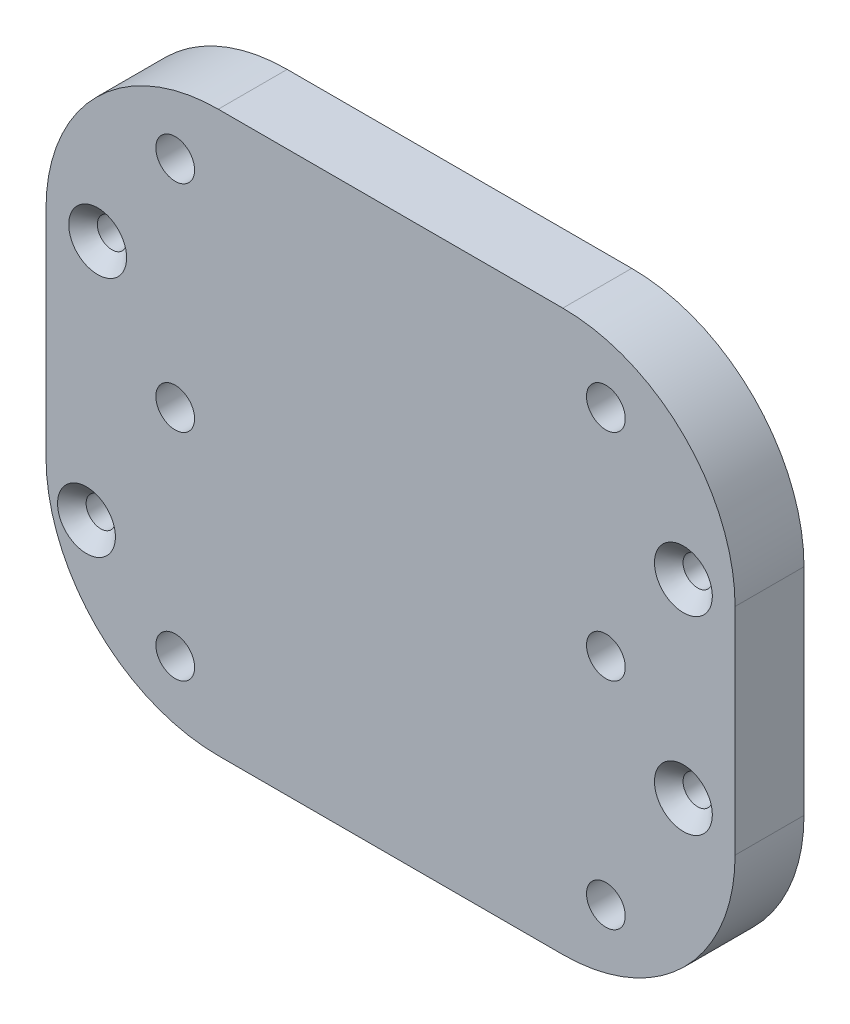
ISO-10303-21;
HEADER;
FILE_DESCRIPTION(('STEP AP214'),'2;1');
FILE_NAME('part.step','',(''),(''),'','','');
FILE_SCHEMA(('AUTOMOTIVE_DESIGN { 1 0 10303 214 1 1 1 1 }'));
ENDSEC;
DATA;
#1=APPLICATION_CONTEXT('core data for automotive mechanical design processes');
#2=APPLICATION_PROTOCOL_DEFINITION('international standard','automotive_design',2000,#1);
#3=PRODUCT_CONTEXT('',#1,'mechanical');
#4=PRODUCT('Part','Part','',(#3));
#5=PRODUCT_RELATED_PRODUCT_CATEGORY('part','',(#4));
#6=PRODUCT_DEFINITION_FORMATION('','',#4);
#7=PRODUCT_DEFINITION_CONTEXT('part definition',#1,'design');
#8=PRODUCT_DEFINITION('design','',#6,#7);
#9=PRODUCT_DEFINITION_SHAPE('','',#8);
#10=(LENGTH_UNIT() NAMED_UNIT(*) SI_UNIT(.MILLI.,.METRE.));
#11=(NAMED_UNIT(*) PLANE_ANGLE_UNIT() SI_UNIT($,.RADIAN.));
#12=(NAMED_UNIT(*) SI_UNIT($,.STERADIAN.) SOLID_ANGLE_UNIT());
#13=UNCERTAINTY_MEASURE_WITH_UNIT(LENGTH_MEASURE(1.E-05),#10,'distance_accuracy_value','');
#14=(GEOMETRIC_REPRESENTATION_CONTEXT(3) GLOBAL_UNCERTAINTY_ASSIGNED_CONTEXT((#13)) GLOBAL_UNIT_ASSIGNED_CONTEXT((#10,
#11,#12)) REPRESENTATION_CONTEXT('',''));
#15=CARTESIAN_POINT('',(0.,0.,0.));
#16=DIRECTION('',(0.,0.,1.));
#17=DIRECTION('',(1.,0.,0.));
#18=AXIS2_PLACEMENT_3D('',#15,#16,#17);
#19=CARTESIAN_POINT('',(84.9999999999998,0.,8.));
#20=DIRECTION('',(0.,1.,0.));
#21=DIRECTION('',(-1.,0.,0.));
#22=AXIS2_PLACEMENT_3D('',#19,#20,#21);
#23=PLANE('',#22);
#24=DIRECTION('',(1.,0.,0.));
#25=VECTOR('',#24,1.);
#26=CARTESIAN_POINT('',(84.9999999999998,0.,8.));
#27=LINE('',#26,#25);
#28=CARTESIAN_POINT('',(25.,0.,8.));
#29=VERTEX_POINT('',#28);
#30=CARTESIAN_POINT('',(64.9999999999998,0.,8.));
#31=VERTEX_POINT('',#30);
#32=EDGE_CURVE('E179',#29,#31,#27,.T.);
#33=ORIENTED_EDGE('',*,*,#32,.F.);
#34=DIRECTION('',(0.,0.,1.));
#35=VECTOR('',#34,1.);
#36=CARTESIAN_POINT('',(25.,0.,0.));
#37=LINE('',#36,#35);
#38=CARTESIAN_POINT('',(25.,0.,0.));
#39=VERTEX_POINT('',#38);
#40=EDGE_CURVE('E155',#29,#39,#37,.F.);
#41=ORIENTED_EDGE('',*,*,#40,.T.);
#42=DIRECTION('',(1.,0.,0.));
#43=VECTOR('',#42,1.);
#44=CARTESIAN_POINT('',(84.9999999999998,0.,0.));
#45=LINE('',#44,#43);
#46=CARTESIAN_POINT('',(64.9999999999998,0.,0.));
#47=VERTEX_POINT('',#46);
#48=EDGE_CURVE('E186',#39,#47,#45,.T.);
#49=ORIENTED_EDGE('',*,*,#48,.T.);
#50=DIRECTION('',(0.,0.,-1.));
#51=VECTOR('',#50,1.);
#52=CARTESIAN_POINT('',(64.9999999999998,0.,8.));
#53=LINE('',#52,#51);
#54=EDGE_CURVE('E152',#47,#31,#53,.F.);
#55=ORIENTED_EDGE('',*,*,#54,.T.);
#56=EDGE_LOOP('',(#33,#41,#49,#55));
#57=FACE_BOUND('',#56,.T.);
#58=ADVANCED_FACE('F39',(#57),#23,.F.);
#59=CARTESIAN_POINT('',(-2.23075399032468E-13,65.,8.));
#60=DIRECTION('',(0.,-1.,0.));
#61=DIRECTION('',(0.,0.,-1.));
#62=AXIS2_PLACEMENT_3D('',#59,#60,#61);
#63=PLANE('',#62);
#64=DIRECTION('',(-1.,0.,0.));
#65=VECTOR('',#64,1.);
#66=CARTESIAN_POINT('',(-2.23075399032468E-13,65.,8.));
#67=LINE('',#66,#65);
#68=CARTESIAN_POINT('',(64.9999999999998,65.,8.));
#69=VERTEX_POINT('',#68);
#70=CARTESIAN_POINT('',(25.,65.,8.));
#71=VERTEX_POINT('',#70);
#72=EDGE_CURVE('E112',#69,#71,#67,.T.);
#73=ORIENTED_EDGE('',*,*,#72,.F.);
#74=DIRECTION('',(0.,0.,-1.));
#75=VECTOR('',#74,1.);
#76=CARTESIAN_POINT('',(64.9999999999998,65.,8.));
#77=LINE('',#76,#75);
#78=CARTESIAN_POINT('',(64.9999999999998,65.,0.));
#79=VERTEX_POINT('',#78);
#80=EDGE_CURVE('E11',#69,#79,#77,.T.);
#81=ORIENTED_EDGE('',*,*,#80,.T.);
#82=DIRECTION('',(-1.,0.,0.));
#83=VECTOR('',#82,1.);
#84=CARTESIAN_POINT('',(-2.23075399032468E-13,65.,0.));
#85=LINE('',#84,#83);
#86=CARTESIAN_POINT('',(25.,65.,0.));
#87=VERTEX_POINT('',#86);
#88=EDGE_CURVE('E177',#79,#87,#85,.T.);
#89=ORIENTED_EDGE('',*,*,#88,.T.);
#90=DIRECTION('',(0.,0.,1.));
#91=VECTOR('',#90,1.);
#92=CARTESIAN_POINT('',(25.,65.,8.));
#93=LINE('',#92,#91);
#94=EDGE_CURVE('E48',#87,#71,#93,.T.);
#95=ORIENTED_EDGE('',*,*,#94,.T.);
#96=EDGE_LOOP('',(#73,#81,#89,#95));
#97=FACE_BOUND('',#96,.T.);
#98=ADVANCED_FACE('F175',(#97),#63,.F.);
#99=CARTESIAN_POINT('',(0.,0.,8.));
#100=DIRECTION('',(0.,0.,-1.));
#101=DIRECTION('',(-1.,0.,0.));
#102=AXIS2_PLACEMENT_3D('',#99,#100,#101);
#103=PLANE('',#102);
#104=CARTESIAN_POINT('',(19.9999999999998,7.49999999999999,8.));
#105=DIRECTION('',(0.,0.,-1.));
#106=DIRECTION('',(-1.,0.,0.));
#107=AXIS2_PLACEMENT_3D('',#104,#105,#106);
#108=CIRCLE('',#107,2.25);
#109=CARTESIAN_POINT('',(17.7499999999998,7.49999999999999,8.));
#110=VERTEX_POINT('',#109);
#111=EDGE_CURVE('E190',#110,#110,#108,.T.);
#112=ORIENTED_EDGE('',*,*,#111,.T.);
#113=EDGE_LOOP('',(#112));
#114=FACE_BOUND('',#113,.T.);
#115=CARTESIAN_POINT('',(69.9999999999997,7.49999999999999,8.));
#116=DIRECTION('',(0.,0.,-1.));
#117=DIRECTION('',(-1.,0.,0.));
#118=AXIS2_PLACEMENT_3D('',#115,#116,#117);
#119=CIRCLE('',#118,2.25);
#120=CARTESIAN_POINT('',(67.7499999999997,7.49999999999999,8.));
#121=VERTEX_POINT('',#120);
#122=EDGE_CURVE('E195',#121,#121,#119,.T.);
#123=ORIENTED_EDGE('',*,*,#122,.T.);
#124=EDGE_LOOP('',(#123));
#125=FACE_BOUND('',#124,.T.);
#126=CARTESIAN_POINT('',(69.9999999999998,32.5,8.));
#127=DIRECTION('',(0.,0.,-1.));
#128=DIRECTION('',(-1.,0.,0.));
#129=AXIS2_PLACEMENT_3D('',#126,#127,#128);
#130=CIRCLE('',#129,2.25);
#131=CARTESIAN_POINT('',(67.7499999999998,32.5,8.));
#132=VERTEX_POINT('',#131);
#133=EDGE_CURVE('E201',#132,#132,#130,.T.);
#134=ORIENTED_EDGE('',*,*,#133,.T.);
#135=EDGE_LOOP('',(#134));
#136=FACE_BOUND('',#135,.T.);
#137=CARTESIAN_POINT('',(19.9999999999998,32.5,8.));
#138=DIRECTION('',(0.,0.,-1.));
#139=DIRECTION('',(-1.,0.,0.));
#140=AXIS2_PLACEMENT_3D('',#137,#138,#139);
#141=CIRCLE('',#140,2.25);
#142=CARTESIAN_POINT('',(17.7499999999998,32.5,8.));
#143=VERTEX_POINT('',#142);
#144=EDGE_CURVE('E207',#143,#143,#141,.T.);
#145=ORIENTED_EDGE('',*,*,#144,.T.);
#146=EDGE_LOOP('',(#145));
#147=FACE_BOUND('',#146,.T.);
#148=CARTESIAN_POINT('',(19.9999999999998,57.5,8.));
#149=DIRECTION('',(0.,0.,-1.));
#150=DIRECTION('',(-1.,0.,0.));
#151=AXIS2_PLACEMENT_3D('',#148,#149,#150);
#152=CIRCLE('',#151,2.25);
#153=CARTESIAN_POINT('',(17.7499999999998,57.5,8.));
#154=VERTEX_POINT('',#153);
#155=EDGE_CURVE('E213',#154,#154,#152,.T.);
#156=ORIENTED_EDGE('',*,*,#155,.T.);
#157=EDGE_LOOP('',(#156));
#158=FACE_BOUND('',#157,.T.);
#159=CARTESIAN_POINT('',(69.9999999999998,57.5,8.));
#160=DIRECTION('',(0.,0.,-1.));
#161=DIRECTION('',(-1.,0.,0.));
#162=AXIS2_PLACEMENT_3D('',#159,#160,#161);
#163=CIRCLE('',#162,2.25);
#164=CARTESIAN_POINT('',(67.7499999999998,57.5,8.));
#165=VERTEX_POINT('',#164);
#166=EDGE_CURVE('E219',#165,#165,#163,.T.);
#167=ORIENTED_EDGE('',*,*,#166,.T.);
#168=EDGE_LOOP('',(#167));
#169=FACE_BOUND('',#168,.T.);
#170=CARTESIAN_POINT('',(9.6999999999999,16.0283122083315,8.));
#171=DIRECTION('',(0.,0.,1.));
#172=DIRECTION('',(1.,0.,0.));
#173=AXIS2_PLACEMENT_3D('',#170,#171,#172);
#174=CIRCLE('',#173,3.36);
#175=CARTESIAN_POINT('',(13.0599999999999,16.0283122083315,8.));
#176=VERTEX_POINT('',#175);
#177=EDGE_CURVE('E234',#176,#176,#174,.T.);
#178=ORIENTED_EDGE('',*,*,#177,.F.);
#179=EDGE_LOOP('',(#178));
#180=FACE_BOUND('',#179,.T.);
#181=CARTESIAN_POINT('',(78.9999999999999,22.7283122083318,8.));
#182=DIRECTION('',(0.,0.,1.));
#183=DIRECTION('',(1.,0.,0.));
#184=AXIS2_PLACEMENT_3D('',#181,#182,#183);
#185=CIRCLE('',#184,3.36);
#186=CARTESIAN_POINT('',(82.3599999999999,22.7283122083318,8.));
#187=VERTEX_POINT('',#186);
#188=EDGE_CURVE('E239',#187,#187,#185,.T.);
#189=ORIENTED_EDGE('',*,*,#188,.F.);
#190=EDGE_LOOP('',(#189));
#191=FACE_BOUND('',#190,.T.);
#192=CARTESIAN_POINT('',(78.9999999999998,44.7283122083318,8.));
#193=DIRECTION('',(0.,0.,1.));
#194=DIRECTION('',(1.,0.,0.));
#195=AXIS2_PLACEMENT_3D('',#192,#193,#194);
#196=CIRCLE('',#195,3.36);
#197=CARTESIAN_POINT('',(82.3599999999998,44.7283122083318,8.));
#198=VERTEX_POINT('',#197);
#199=EDGE_CURVE('E248',#198,#198,#196,.T.);
#200=ORIENTED_EDGE('',*,*,#199,.F.);
#201=EDGE_LOOP('',(#200));
#202=FACE_BOUND('',#201,.T.);
#203=CARTESIAN_POINT('',(10.9999999999998,44.7283122083316,8.));
#204=DIRECTION('',(0.,0.,1.));
#205=DIRECTION('',(1.,0.,0.));
#206=AXIS2_PLACEMENT_3D('',#203,#204,#205);
#207=CIRCLE('',#206,3.36);
#208=CARTESIAN_POINT('',(14.3599999999998,44.7283122083316,8.));
#209=VERTEX_POINT('',#208);
#210=EDGE_CURVE('E344',#209,#209,#207,.T.);
#211=ORIENTED_EDGE('',*,*,#210,.F.);
#212=EDGE_LOOP('',(#211));
#213=FACE_BOUND('',#212,.T.);
#214=DIRECTION('',(0.,-1.,0.));
#215=VECTOR('',#214,1.);
#216=CARTESIAN_POINT('',(5.00000000000001,0.,8.));
#217=LINE('',#216,#215);
#218=CARTESIAN_POINT('',(5.,45.,8.));
#219=VERTEX_POINT('',#218);
#220=CARTESIAN_POINT('',(5.00000000000001,20.,8.));
#221=VERTEX_POINT('',#220);
#222=EDGE_CURVE('E110',#219,#221,#217,.T.);
#223=ORIENTED_EDGE('',*,*,#222,.T.);
#224=CARTESIAN_POINT('',(25.,20.,8.));
#225=DIRECTION('',(0.,0.,-1.));
#226=DIRECTION('',(-1.,0.,0.));
#227=AXIS2_PLACEMENT_3D('',#224,#225,#226);
#228=CIRCLE('',#227,20.);
#229=EDGE_CURVE('E149',#221,#29,#228,.F.);
#230=ORIENTED_EDGE('',*,*,#229,.T.);
#231=ORIENTED_EDGE('',*,*,#32,.T.);
#232=CARTESIAN_POINT('',(64.9999999999998,20.,8.));
#233=DIRECTION('',(0.,0.,-1.));
#234=DIRECTION('',(-1.,0.,0.));
#235=AXIS2_PLACEMENT_3D('',#232,#233,#234);
#236=CIRCLE('',#235,20.);
#237=CARTESIAN_POINT('',(84.9999999999998,20.,8.));
#238=VERTEX_POINT('',#237);
#239=EDGE_CURVE('E146',#31,#238,#236,.F.);
#240=ORIENTED_EDGE('',*,*,#239,.T.);
#241=DIRECTION('',(0.,1.,0.));
#242=VECTOR('',#241,1.);
#243=CARTESIAN_POINT('',(84.9999999999998,65.,8.));
#244=LINE('',#243,#242);
#245=CARTESIAN_POINT('',(84.9999999999998,45.,8.));
#246=VERTEX_POINT('',#245);
#247=EDGE_CURVE('E138',#238,#246,#244,.T.);
#248=ORIENTED_EDGE('',*,*,#247,.T.);
#249=CARTESIAN_POINT('',(64.9999999999998,45.,8.));
#250=DIRECTION('',(0.,0.,-1.));
#251=DIRECTION('',(-1.,0.,0.));
#252=AXIS2_PLACEMENT_3D('',#249,#250,#251);
#253=CIRCLE('',#252,20.);
#254=EDGE_CURVE('E118',#246,#69,#253,.F.);
#255=ORIENTED_EDGE('',*,*,#254,.T.);
#256=ORIENTED_EDGE('',*,*,#72,.T.);
#257=CARTESIAN_POINT('',(25.,45.,8.));
#258=DIRECTION('',(0.,0.,-1.));
#259=DIRECTION('',(-1.,0.,0.));
#260=AXIS2_PLACEMENT_3D('',#257,#258,#259);
#261=CIRCLE('',#260,20.);
#262=EDGE_CURVE('E107',#71,#219,#261,.F.);
#263=ORIENTED_EDGE('',*,*,#262,.T.);
#264=EDGE_LOOP('',(#223,#230,#231,#240,#248,#255,#256,#263));
#265=FACE_BOUND('',#264,.T.);
#266=ADVANCED_FACE('F109',(#114,#125,#136,#147,#158,#169,#180,#191,#202,#213,#265),#103,.F.);
#267=CARTESIAN_POINT('',(0.,0.,0.));
#268=DIRECTION('',(0.,0.,-1.));
#269=DIRECTION('',(-1.,0.,0.));
#270=AXIS2_PLACEMENT_3D('',#267,#268,#269);
#271=PLANE('',#270);
#272=CARTESIAN_POINT('',(10.9999999999998,44.7283122083316,0.));
#273=DIRECTION('',(0.,0.,-1.));
#274=DIRECTION('',(-1.,0.,0.));
#275=AXIS2_PLACEMENT_3D('',#272,#273,#274);
#276=CIRCLE('',#275,1.7);
#277=CARTESIAN_POINT('',(9.29999999999981,44.7283122083316,0.));
#278=VERTEX_POINT('',#277);
#279=EDGE_CURVE('E141',#278,#278,#276,.T.);
#280=ORIENTED_EDGE('',*,*,#279,.F.);
#281=EDGE_LOOP('',(#280));
#282=FACE_BOUND('',#281,.T.);
#283=CARTESIAN_POINT('',(78.9999999999998,44.7283122083318,0.));
#284=DIRECTION('',(0.,0.,-1.));
#285=DIRECTION('',(-1.,0.,0.));
#286=AXIS2_PLACEMENT_3D('',#283,#284,#285);
#287=CIRCLE('',#286,1.69999999999999);
#288=CARTESIAN_POINT('',(77.2999999999998,44.7283122083318,0.));
#289=VERTEX_POINT('',#288);
#290=EDGE_CURVE('E236',#289,#289,#287,.T.);
#291=ORIENTED_EDGE('',*,*,#290,.F.);
#292=EDGE_LOOP('',(#291));
#293=FACE_BOUND('',#292,.T.);
#294=CARTESIAN_POINT('',(78.9999999999999,22.7283122083318,0.));
#295=DIRECTION('',(0.,0.,-1.));
#296=DIRECTION('',(-1.,0.,0.));
#297=AXIS2_PLACEMENT_3D('',#294,#295,#296);
#298=CIRCLE('',#297,1.69999999999999);
#299=CARTESIAN_POINT('',(77.2999999999999,22.7283122083318,0.));
#300=VERTEX_POINT('',#299);
#301=EDGE_CURVE('E231',#300,#300,#298,.T.);
#302=ORIENTED_EDGE('',*,*,#301,.F.);
#303=EDGE_LOOP('',(#302));
#304=FACE_BOUND('',#303,.T.);
#305=CARTESIAN_POINT('',(9.6999999999999,16.0283122083315,0.));
#306=DIRECTION('',(0.,0.,-1.));
#307=DIRECTION('',(-1.,0.,0.));
#308=AXIS2_PLACEMENT_3D('',#305,#306,#307);
#309=CIRCLE('',#308,1.7);
#310=CARTESIAN_POINT('',(7.9999999999999,16.0283122083315,0.));
#311=VERTEX_POINT('',#310);
#312=EDGE_CURVE('E225',#311,#311,#309,.T.);
#313=ORIENTED_EDGE('',*,*,#312,.F.);
#314=EDGE_LOOP('',(#313));
#315=FACE_BOUND('',#314,.T.);
#316=CARTESIAN_POINT('',(69.9999999999998,57.5,0.));
#317=DIRECTION('',(0.,0.,-1.));
#318=DIRECTION('',(-1.,0.,0.));
#319=AXIS2_PLACEMENT_3D('',#316,#317,#318);
#320=CIRCLE('',#319,4.48);
#321=CARTESIAN_POINT('',(65.5199999999998,57.5,0.));
#322=VERTEX_POINT('',#321);
#323=EDGE_CURVE('E229',#322,#322,#320,.T.);
#324=ORIENTED_EDGE('',*,*,#323,.F.);
#325=EDGE_LOOP('',(#324));
#326=FACE_BOUND('',#325,.T.);
#327=CARTESIAN_POINT('',(19.9999999999998,57.5,0.));
#328=DIRECTION('',(0.,0.,-1.));
#329=DIRECTION('',(-1.,0.,0.));
#330=AXIS2_PLACEMENT_3D('',#327,#328,#329);
#331=CIRCLE('',#330,4.48);
#332=CARTESIAN_POINT('',(15.5199999999998,57.5,0.));
#333=VERTEX_POINT('',#332);
#334=EDGE_CURVE('E223',#333,#333,#331,.T.);
#335=ORIENTED_EDGE('',*,*,#334,.F.);
#336=EDGE_LOOP('',(#335));
#337=FACE_BOUND('',#336,.T.);
#338=CARTESIAN_POINT('',(19.9999999999998,32.5,0.));
#339=DIRECTION('',(0.,0.,-1.));
#340=DIRECTION('',(-1.,0.,0.));
#341=AXIS2_PLACEMENT_3D('',#338,#339,#340);
#342=CIRCLE('',#341,4.48);
#343=CARTESIAN_POINT('',(15.5199999999998,32.5,0.));
#344=VERTEX_POINT('',#343);
#345=EDGE_CURVE('E217',#344,#344,#342,.T.);
#346=ORIENTED_EDGE('',*,*,#345,.F.);
#347=EDGE_LOOP('',(#346));
#348=FACE_BOUND('',#347,.T.);
#349=CARTESIAN_POINT('',(69.9999999999998,32.5,0.));
#350=DIRECTION('',(0.,0.,-1.));
#351=DIRECTION('',(-1.,0.,0.));
#352=AXIS2_PLACEMENT_3D('',#349,#350,#351);
#353=CIRCLE('',#352,4.48);
#354=CARTESIAN_POINT('',(65.5199999999998,32.5,0.));
#355=VERTEX_POINT('',#354);
#356=EDGE_CURVE('E211',#355,#355,#353,.T.);
#357=ORIENTED_EDGE('',*,*,#356,.F.);
#358=EDGE_LOOP('',(#357));
#359=FACE_BOUND('',#358,.T.);
#360=CARTESIAN_POINT('',(69.9999999999997,7.49999999999999,0.));
#361=DIRECTION('',(0.,0.,-1.));
#362=DIRECTION('',(-1.,0.,0.));
#363=AXIS2_PLACEMENT_3D('',#360,#361,#362);
#364=CIRCLE('',#363,4.48);
#365=CARTESIAN_POINT('',(65.5199999999997,7.49999999999999,0.));
#366=VERTEX_POINT('',#365);
#367=EDGE_CURVE('E205',#366,#366,#364,.T.);
#368=ORIENTED_EDGE('',*,*,#367,.F.);
#369=EDGE_LOOP('',(#368));
#370=FACE_BOUND('',#369,.T.);
#371=CARTESIAN_POINT('',(19.9999999999998,7.49999999999999,0.));
#372=DIRECTION('',(0.,0.,-1.));
#373=DIRECTION('',(-1.,0.,0.));
#374=AXIS2_PLACEMENT_3D('',#371,#372,#373);
#375=CIRCLE('',#374,4.48);
#376=CARTESIAN_POINT('',(15.5199999999998,7.49999999999999,0.));
#377=VERTEX_POINT('',#376);
#378=EDGE_CURVE('E199',#377,#377,#375,.T.);
#379=ORIENTED_EDGE('',*,*,#378,.F.);
#380=EDGE_LOOP('',(#379));
#381=FACE_BOUND('',#380,.T.);
#382=ORIENTED_EDGE('',*,*,#48,.F.);
#383=CARTESIAN_POINT('',(25.,20.,0.));
#384=DIRECTION('',(0.,0.,-1.));
#385=DIRECTION('',(-1.,0.,0.));
#386=AXIS2_PLACEMENT_3D('',#383,#384,#385);
#387=CIRCLE('',#386,20.);
#388=CARTESIAN_POINT('',(5.00000000000001,20.,0.));
#389=VERTEX_POINT('',#388);
#390=EDGE_CURVE('E164',#39,#389,#387,.T.);
#391=ORIENTED_EDGE('',*,*,#390,.T.);
#392=DIRECTION('',(0.,-1.,0.));
#393=VECTOR('',#392,1.);
#394=CARTESIAN_POINT('',(5.00000000000001,0.,0.));
#395=LINE('',#394,#393);
#396=CARTESIAN_POINT('',(5.,45.,0.));
#397=VERTEX_POINT('',#396);
#398=EDGE_CURVE('E129',#397,#389,#395,.T.);
#399=ORIENTED_EDGE('',*,*,#398,.F.);
#400=CARTESIAN_POINT('',(25.,45.,0.));
#401=DIRECTION('',(0.,0.,-1.));
#402=DIRECTION('',(-1.,0.,0.));
#403=AXIS2_PLACEMENT_3D('',#400,#401,#402);
#404=CIRCLE('',#403,20.);
#405=EDGE_CURVE('E132',#397,#87,#404,.T.);
#406=ORIENTED_EDGE('',*,*,#405,.T.);
#407=ORIENTED_EDGE('',*,*,#88,.F.);
#408=CARTESIAN_POINT('',(64.9999999999998,45.,0.));
#409=DIRECTION('',(0.,0.,-1.));
#410=DIRECTION('',(-1.,0.,0.));
#411=AXIS2_PLACEMENT_3D('',#408,#409,#410);
#412=CIRCLE('',#411,20.);
#413=CARTESIAN_POINT('',(84.9999999999998,45.,0.));
#414=VERTEX_POINT('',#413);
#415=EDGE_CURVE('E55',#79,#414,#412,.T.);
#416=ORIENTED_EDGE('',*,*,#415,.T.);
#417=DIRECTION('',(0.,1.,0.));
#418=VECTOR('',#417,1.);
#419=CARTESIAN_POINT('',(84.9999999999998,65.,0.));
#420=LINE('',#419,#418);
#421=CARTESIAN_POINT('',(84.9999999999998,20.,0.));
#422=VERTEX_POINT('',#421);
#423=EDGE_CURVE('E180',#422,#414,#420,.T.);
#424=ORIENTED_EDGE('',*,*,#423,.F.);
#425=CARTESIAN_POINT('',(64.9999999999998,20.,0.));
#426=DIRECTION('',(0.,0.,-1.));
#427=DIRECTION('',(-1.,0.,0.));
#428=AXIS2_PLACEMENT_3D('',#425,#426,#427);
#429=CIRCLE('',#428,20.);
#430=EDGE_CURVE('E63',#422,#47,#429,.T.);
#431=ORIENTED_EDGE('',*,*,#430,.T.);
#432=EDGE_LOOP('',(#382,#391,#399,#406,#407,#416,#424,#431));
#433=FACE_BOUND('',#432,.T.);
#434=ADVANCED_FACE('F342',(#282,#293,#304,#315,#326,#337,#348,#359,#370,#381,#433),#271,.T.);
#435=CARTESIAN_POINT('',(84.9999999999998,65.,8.));
#436=DIRECTION('',(-1.,0.,0.));
#437=DIRECTION('',(0.,0.,1.));
#438=AXIS2_PLACEMENT_3D('',#435,#436,#437);
#439=PLANE('',#438);
#440=ORIENTED_EDGE('',*,*,#247,.F.);
#441=DIRECTION('',(0.,0.,-1.));
#442=VECTOR('',#441,1.);
#443=CARTESIAN_POINT('',(84.9999999999998,20.,8.));
#444=LINE('',#443,#442);
#445=EDGE_CURVE('E170',#238,#422,#444,.T.);
#446=ORIENTED_EDGE('',*,*,#445,.T.);
#447=ORIENTED_EDGE('',*,*,#423,.T.);
#448=DIRECTION('',(0.,0.,-1.));
#449=VECTOR('',#448,1.);
#450=CARTESIAN_POINT('',(84.9999999999998,45.,8.));
#451=LINE('',#450,#449);
#452=EDGE_CURVE('E167',#414,#246,#451,.F.);
#453=ORIENTED_EDGE('',*,*,#452,.T.);
#454=EDGE_LOOP('',(#440,#446,#447,#453));
#455=FACE_BOUND('',#454,.T.);
#456=ADVANCED_FACE('F316',(#455),#439,.F.);
#457=CARTESIAN_POINT('',(19.9999999999998,7.49999999999999,0.));
#458=DIRECTION('',(0.,0.,-1.));
#459=DIRECTION('',(-1.,0.,0.));
#460=AXIS2_PLACEMENT_3D('',#457,#458,#459);
#461=CYLINDRICAL_SURFACE('',#460,2.25);
#462=CARTESIAN_POINT('',(19.9999999999998,7.49999999999999,2.23));
#463=DIRECTION('',(0.,0.,-1.));
#464=DIRECTION('',(-1.,0.,0.));
#465=AXIS2_PLACEMENT_3D('',#462,#463,#464);
#466=CIRCLE('',#465,2.25);
#467=CARTESIAN_POINT('',(17.7499999999998,7.49999999999999,2.23));
#468=VERTEX_POINT('',#467);
#469=EDGE_CURVE('E194',#468,#468,#466,.T.);
#470=ORIENTED_EDGE('',*,*,#469,.T.);
#471=EDGE_LOOP('',(#470));
#472=FACE_BOUND('',#471,.T.);
#473=ORIENTED_EDGE('',*,*,#111,.F.);
#474=EDGE_LOOP('',(#473));
#475=FACE_BOUND('',#474,.T.);
#476=ADVANCED_FACE('F383',(#472,#475),#461,.F.);
#477=CARTESIAN_POINT('',(19.9999999999998,7.49999999999999,0.));
#478=DIRECTION('',(0.,0.,-1.));
#479=DIRECTION('',(-1.,0.,0.));
#480=AXIS2_PLACEMENT_3D('',#477,#478,#479);
#481=CONICAL_SURFACE('',#480,4.48,0.785398163397449);
#482=ORIENTED_EDGE('',*,*,#469,.F.);
#483=EDGE_LOOP('',(#482));
#484=FACE_BOUND('',#483,.T.);
#485=ORIENTED_EDGE('',*,*,#378,.T.);
#486=EDGE_LOOP('',(#485));
#487=FACE_BOUND('',#486,.T.);
#488=ADVANCED_FACE('F380',(#484,#487),#481,.F.);
#489=CARTESIAN_POINT('',(69.9999999999997,7.49999999999999,0.));
#490=DIRECTION('',(0.,0.,-1.));
#491=DIRECTION('',(-1.,0.,0.));
#492=AXIS2_PLACEMENT_3D('',#489,#490,#491);
#493=CYLINDRICAL_SURFACE('',#492,2.25);
#494=CARTESIAN_POINT('',(69.9999999999997,7.49999999999999,2.23));
#495=DIRECTION('',(0.,0.,-1.));
#496=DIRECTION('',(-1.,0.,0.));
#497=AXIS2_PLACEMENT_3D('',#494,#495,#496);
#498=CIRCLE('',#497,2.25);
#499=CARTESIAN_POINT('',(67.7499999999997,7.49999999999999,2.23));
#500=VERTEX_POINT('',#499);
#501=EDGE_CURVE('E200',#500,#500,#498,.T.);
#502=ORIENTED_EDGE('',*,*,#501,.T.);
#503=EDGE_LOOP('',(#502));
#504=FACE_BOUND('',#503,.T.);
#505=ORIENTED_EDGE('',*,*,#122,.F.);
#506=EDGE_LOOP('',(#505));
#507=FACE_BOUND('',#506,.T.);
#508=ADVANCED_FACE('F382',(#504,#507),#493,.F.);
#509=CARTESIAN_POINT('',(69.9999999999997,7.49999999999999,0.));
#510=DIRECTION('',(0.,0.,-1.));
#511=DIRECTION('',(-1.,0.,0.));
#512=AXIS2_PLACEMENT_3D('',#509,#510,#511);
#513=CONICAL_SURFACE('',#512,4.48,0.785398163397447);
#514=ORIENTED_EDGE('',*,*,#501,.F.);
#515=EDGE_LOOP('',(#514));
#516=FACE_BOUND('',#515,.T.);
#517=ORIENTED_EDGE('',*,*,#367,.T.);
#518=EDGE_LOOP('',(#517));
#519=FACE_BOUND('',#518,.T.);
#520=ADVANCED_FACE('F390',(#516,#519),#513,.F.);
#521=CARTESIAN_POINT('',(69.9999999999998,32.5,0.));
#522=DIRECTION('',(0.,0.,-1.));
#523=DIRECTION('',(-1.,0.,0.));
#524=AXIS2_PLACEMENT_3D('',#521,#522,#523);
#525=CYLINDRICAL_SURFACE('',#524,2.25);
#526=CARTESIAN_POINT('',(69.9999999999998,32.5,2.23));
#527=DIRECTION('',(0.,0.,-1.));
#528=DIRECTION('',(-1.,0.,0.));
#529=AXIS2_PLACEMENT_3D('',#526,#527,#528);
#530=CIRCLE('',#529,2.25);
#531=CARTESIAN_POINT('',(67.7499999999998,32.5,2.23));
#532=VERTEX_POINT('',#531);
#533=EDGE_CURVE('E206',#532,#532,#530,.T.);
#534=ORIENTED_EDGE('',*,*,#533,.T.);
#535=EDGE_LOOP('',(#534));
#536=FACE_BOUND('',#535,.T.);
#537=ORIENTED_EDGE('',*,*,#133,.F.);
#538=EDGE_LOOP('',(#537));
#539=FACE_BOUND('',#538,.T.);
#540=ADVANCED_FACE('F480',(#536,#539),#525,.F.);
#541=CARTESIAN_POINT('',(69.9999999999998,32.5,0.));
#542=DIRECTION('',(0.,0.,-1.));
#543=DIRECTION('',(-1.,0.,0.));
#544=AXIS2_PLACEMENT_3D('',#541,#542,#543);
#545=CONICAL_SURFACE('',#544,4.48,0.785398163397447);
#546=ORIENTED_EDGE('',*,*,#533,.F.);
#547=EDGE_LOOP('',(#546));
#548=FACE_BOUND('',#547,.T.);
#549=ORIENTED_EDGE('',*,*,#356,.T.);
#550=EDGE_LOOP('',(#549));
#551=FACE_BOUND('',#550,.T.);
#552=ADVANCED_FACE('F476',(#548,#551),#545,.F.);
#553=CARTESIAN_POINT('',(19.9999999999998,32.5,0.));
#554=DIRECTION('',(0.,0.,-1.));
#555=DIRECTION('',(-1.,0.,0.));
#556=AXIS2_PLACEMENT_3D('',#553,#554,#555);
#557=CYLINDRICAL_SURFACE('',#556,2.25);
#558=CARTESIAN_POINT('',(19.9999999999998,32.5,2.23));
#559=DIRECTION('',(0.,0.,-1.));
#560=DIRECTION('',(-1.,0.,0.));
#561=AXIS2_PLACEMENT_3D('',#558,#559,#560);
#562=CIRCLE('',#561,2.25);
#563=CARTESIAN_POINT('',(17.7499999999998,32.5,2.23));
#564=VERTEX_POINT('',#563);
#565=EDGE_CURVE('E212',#564,#564,#562,.T.);
#566=ORIENTED_EDGE('',*,*,#565,.T.);
#567=EDGE_LOOP('',(#566));
#568=FACE_BOUND('',#567,.T.);
#569=ORIENTED_EDGE('',*,*,#144,.F.);
#570=EDGE_LOOP('',(#569));
#571=FACE_BOUND('',#570,.T.);
#572=ADVANCED_FACE('F472',(#568,#571),#557,.F.);
#573=CARTESIAN_POINT('',(19.9999999999998,32.5,0.));
#574=DIRECTION('',(0.,0.,-1.));
#575=DIRECTION('',(-1.,0.,0.));
#576=AXIS2_PLACEMENT_3D('',#573,#574,#575);
#577=CONICAL_SURFACE('',#576,4.48,0.785398163397449);
#578=ORIENTED_EDGE('',*,*,#565,.F.);
#579=EDGE_LOOP('',(#578));
#580=FACE_BOUND('',#579,.T.);
#581=ORIENTED_EDGE('',*,*,#345,.T.);
#582=EDGE_LOOP('',(#581));
#583=FACE_BOUND('',#582,.T.);
#584=ADVANCED_FACE('F468',(#580,#583),#577,.F.);
#585=CARTESIAN_POINT('',(19.9999999999998,57.5,0.));
#586=DIRECTION('',(0.,0.,-1.));
#587=DIRECTION('',(-1.,0.,0.));
#588=AXIS2_PLACEMENT_3D('',#585,#586,#587);
#589=CYLINDRICAL_SURFACE('',#588,2.25);
#590=CARTESIAN_POINT('',(19.9999999999998,57.5,2.23));
#591=DIRECTION('',(0.,0.,-1.));
#592=DIRECTION('',(-1.,0.,0.));
#593=AXIS2_PLACEMENT_3D('',#590,#591,#592);
#594=CIRCLE('',#593,2.25);
#595=CARTESIAN_POINT('',(17.7499999999998,57.5,2.23));
#596=VERTEX_POINT('',#595);
#597=EDGE_CURVE('E218',#596,#596,#594,.T.);
#598=ORIENTED_EDGE('',*,*,#597,.T.);
#599=EDGE_LOOP('',(#598));
#600=FACE_BOUND('',#599,.T.);
#601=ORIENTED_EDGE('',*,*,#155,.F.);
#602=EDGE_LOOP('',(#601));
#603=FACE_BOUND('',#602,.T.);
#604=ADVANCED_FACE('F464',(#600,#603),#589,.F.);
#605=CARTESIAN_POINT('',(19.9999999999998,57.5,0.));
#606=DIRECTION('',(0.,0.,-1.));
#607=DIRECTION('',(-1.,0.,0.));
#608=AXIS2_PLACEMENT_3D('',#605,#606,#607);
#609=CONICAL_SURFACE('',#608,4.48,0.785398163397449);
#610=ORIENTED_EDGE('',*,*,#597,.F.);
#611=EDGE_LOOP('',(#610));
#612=FACE_BOUND('',#611,.T.);
#613=ORIENTED_EDGE('',*,*,#334,.T.);
#614=EDGE_LOOP('',(#613));
#615=FACE_BOUND('',#614,.T.);
#616=ADVANCED_FACE('F460',(#612,#615),#609,.F.);
#617=CARTESIAN_POINT('',(69.9999999999998,57.5,0.));
#618=DIRECTION('',(0.,0.,-1.));
#619=DIRECTION('',(-1.,0.,0.));
#620=AXIS2_PLACEMENT_3D('',#617,#618,#619);
#621=CYLINDRICAL_SURFACE('',#620,2.25);
#622=CARTESIAN_POINT('',(69.9999999999998,57.5,2.23));
#623=DIRECTION('',(0.,0.,-1.));
#624=DIRECTION('',(-1.,0.,0.));
#625=AXIS2_PLACEMENT_3D('',#622,#623,#624);
#626=CIRCLE('',#625,2.25);
#627=CARTESIAN_POINT('',(67.7499999999998,57.5,2.23));
#628=VERTEX_POINT('',#627);
#629=EDGE_CURVE('E224',#628,#628,#626,.T.);
#630=ORIENTED_EDGE('',*,*,#629,.T.);
#631=EDGE_LOOP('',(#630));
#632=FACE_BOUND('',#631,.T.);
#633=ORIENTED_EDGE('',*,*,#166,.F.);
#634=EDGE_LOOP('',(#633));
#635=FACE_BOUND('',#634,.T.);
#636=ADVANCED_FACE('F456',(#632,#635),#621,.F.);
#637=CARTESIAN_POINT('',(69.9999999999998,57.5,0.));
#638=DIRECTION('',(0.,0.,-1.));
#639=DIRECTION('',(-1.,0.,0.));
#640=AXIS2_PLACEMENT_3D('',#637,#638,#639);
#641=CONICAL_SURFACE('',#640,4.48,0.785398163397447);
#642=ORIENTED_EDGE('',*,*,#629,.F.);
#643=EDGE_LOOP('',(#642));
#644=FACE_BOUND('',#643,.T.);
#645=ORIENTED_EDGE('',*,*,#323,.T.);
#646=EDGE_LOOP('',(#645));
#647=FACE_BOUND('',#646,.T.);
#648=ADVANCED_FACE('F452',(#644,#647),#641,.F.);
#649=CARTESIAN_POINT('',(9.6999999999999,16.0283122083315,8.));
#650=DIRECTION('',(0.,0.,1.));
#651=DIRECTION('',(1.,0.,0.));
#652=AXIS2_PLACEMENT_3D('',#649,#650,#651);
#653=CYLINDRICAL_SURFACE('',#652,1.7);
#654=ORIENTED_EDGE('',*,*,#312,.T.);
#655=EDGE_LOOP('',(#654));
#656=FACE_BOUND('',#655,.T.);
#657=CARTESIAN_POINT('',(9.6999999999999,16.0283122083315,6.34));
#658=DIRECTION('',(0.,0.,1.));
#659=DIRECTION('',(1.,0.,0.));
#660=AXIS2_PLACEMENT_3D('',#657,#658,#659);
#661=CIRCLE('',#660,1.7);
#662=CARTESIAN_POINT('',(11.3999999999999,16.0283122083315,6.34));
#663=VERTEX_POINT('',#662);
#664=EDGE_CURVE('E230',#663,#663,#661,.T.);
#665=ORIENTED_EDGE('',*,*,#664,.T.);
#666=EDGE_LOOP('',(#665));
#667=FACE_BOUND('',#666,.T.);
#668=ADVANCED_FACE('F448',(#656,#667),#653,.F.);
#669=CARTESIAN_POINT('',(9.6999999999999,16.0283122083315,8.));
#670=DIRECTION('',(0.,0.,1.));
#671=DIRECTION('',(1.,0.,0.));
#672=AXIS2_PLACEMENT_3D('',#669,#670,#671);
#673=CONICAL_SURFACE('',#672,3.36,0.785398163397448);
#674=ORIENTED_EDGE('',*,*,#664,.F.);
#675=EDGE_LOOP('',(#674));
#676=FACE_BOUND('',#675,.T.);
#677=ORIENTED_EDGE('',*,*,#177,.T.);
#678=EDGE_LOOP('',(#677));
#679=FACE_BOUND('',#678,.T.);
#680=ADVANCED_FACE('F444',(#676,#679),#673,.F.);
#681=CARTESIAN_POINT('',(78.9999999999999,22.7283122083318,8.));
#682=DIRECTION('',(0.,0.,1.));
#683=DIRECTION('',(1.,0.,0.));
#684=AXIS2_PLACEMENT_3D('',#681,#682,#683);
#685=CYLINDRICAL_SURFACE('',#684,1.69999999999999);
#686=ORIENTED_EDGE('',*,*,#301,.T.);
#687=EDGE_LOOP('',(#686));
#688=FACE_BOUND('',#687,.T.);
#689=CARTESIAN_POINT('',(78.9999999999999,22.7283122083318,6.34));
#690=DIRECTION('',(0.,0.,1.));
#691=DIRECTION('',(1.,0.,0.));
#692=AXIS2_PLACEMENT_3D('',#689,#690,#691);
#693=CIRCLE('',#692,1.69999999999999);
#694=CARTESIAN_POINT('',(80.6999999999999,22.7283122083318,6.34));
#695=VERTEX_POINT('',#694);
#696=EDGE_CURVE('E235',#695,#695,#693,.T.);
#697=ORIENTED_EDGE('',*,*,#696,.T.);
#698=EDGE_LOOP('',(#697));
#699=FACE_BOUND('',#698,.T.);
#700=ADVANCED_FACE('F440',(#688,#699),#685,.F.);
#701=CARTESIAN_POINT('',(78.9999999999999,22.7283122083318,8.));
#702=DIRECTION('',(0.,0.,1.));
#703=DIRECTION('',(1.,0.,0.));
#704=AXIS2_PLACEMENT_3D('',#701,#702,#703);
#705=CONICAL_SURFACE('',#704,3.36,0.78539816339745);
#706=ORIENTED_EDGE('',*,*,#696,.F.);
#707=EDGE_LOOP('',(#706));
#708=FACE_BOUND('',#707,.T.);
#709=ORIENTED_EDGE('',*,*,#188,.T.);
#710=EDGE_LOOP('',(#709));
#711=FACE_BOUND('',#710,.T.);
#712=ADVANCED_FACE('F437',(#708,#711),#705,.F.);
#713=CARTESIAN_POINT('',(78.9999999999998,44.7283122083318,8.));
#714=DIRECTION('',(0.,0.,1.));
#715=DIRECTION('',(1.,0.,0.));
#716=AXIS2_PLACEMENT_3D('',#713,#714,#715);
#717=CYLINDRICAL_SURFACE('',#716,1.69999999999999);
#718=ORIENTED_EDGE('',*,*,#290,.T.);
#719=EDGE_LOOP('',(#718));
#720=FACE_BOUND('',#719,.T.);
#721=CARTESIAN_POINT('',(78.9999999999998,44.7283122083318,6.34));
#722=DIRECTION('',(0.,0.,1.));
#723=DIRECTION('',(1.,0.,0.));
#724=AXIS2_PLACEMENT_3D('',#721,#722,#723);
#725=CIRCLE('',#724,1.69999999999999);
#726=CARTESIAN_POINT('',(80.6999999999998,44.7283122083318,6.34));
#727=VERTEX_POINT('',#726);
#728=EDGE_CURVE('E240',#727,#727,#725,.T.);
#729=ORIENTED_EDGE('',*,*,#728,.T.);
#730=EDGE_LOOP('',(#729));
#731=FACE_BOUND('',#730,.T.);
#732=ADVANCED_FACE('F433',(#720,#731),#717,.F.);
#733=CARTESIAN_POINT('',(78.9999999999998,44.7283122083318,8.));
#734=DIRECTION('',(0.,0.,1.));
#735=DIRECTION('',(1.,0.,0.));
#736=AXIS2_PLACEMENT_3D('',#733,#734,#735);
#737=CONICAL_SURFACE('',#736,3.36,0.78539816339745);
#738=ORIENTED_EDGE('',*,*,#728,.F.);
#739=EDGE_LOOP('',(#738));
#740=FACE_BOUND('',#739,.T.);
#741=ORIENTED_EDGE('',*,*,#199,.T.);
#742=EDGE_LOOP('',(#741));
#743=FACE_BOUND('',#742,.T.);
#744=ADVANCED_FACE('F428',(#740,#743),#737,.F.);
#745=CARTESIAN_POINT('',(10.9999999999998,44.7283122083316,8.));
#746=DIRECTION('',(0.,0.,1.));
#747=DIRECTION('',(1.,0.,0.));
#748=AXIS2_PLACEMENT_3D('',#745,#746,#747);
#749=CYLINDRICAL_SURFACE('',#748,1.7);
#750=ORIENTED_EDGE('',*,*,#279,.T.);
#751=EDGE_LOOP('',(#750));
#752=FACE_BOUND('',#751,.T.);
#753=CARTESIAN_POINT('',(10.9999999999998,44.7283122083316,6.34));
#754=DIRECTION('',(0.,0.,1.));
#755=DIRECTION('',(1.,0.,0.));
#756=AXIS2_PLACEMENT_3D('',#753,#754,#755);
#757=CIRCLE('',#756,1.7);
#758=CARTESIAN_POINT('',(12.6999999999998,44.7283122083316,6.34));
#759=VERTEX_POINT('',#758);
#760=EDGE_CURVE('E348',#759,#759,#757,.T.);
#761=ORIENTED_EDGE('',*,*,#760,.T.);
#762=EDGE_LOOP('',(#761));
#763=FACE_BOUND('',#762,.T.);
#764=ADVANCED_FACE('F358',(#752,#763),#749,.F.);
#765=CARTESIAN_POINT('',(10.9999999999998,44.7283122083316,8.));
#766=DIRECTION('',(0.,0.,1.));
#767=DIRECTION('',(1.,0.,0.));
#768=AXIS2_PLACEMENT_3D('',#765,#766,#767);
#769=CONICAL_SURFACE('',#768,3.36,0.785398163397448);
#770=ORIENTED_EDGE('',*,*,#760,.F.);
#771=EDGE_LOOP('',(#770));
#772=FACE_BOUND('',#771,.T.);
#773=ORIENTED_EDGE('',*,*,#210,.T.);
#774=EDGE_LOOP('',(#773));
#775=FACE_BOUND('',#774,.T.);
#776=ADVANCED_FACE('F340',(#772,#775),#769,.F.);
#777=CARTESIAN_POINT('',(5.00000000000001,0.,0.));
#778=DIRECTION('',(-1.,0.,0.));
#779=DIRECTION('',(0.,-1.,0.));
#780=AXIS2_PLACEMENT_3D('',#777,#778,#779);
#781=PLANE('',#780);
#782=ORIENTED_EDGE('',*,*,#398,.T.);
#783=DIRECTION('',(0.,0.,1.));
#784=VECTOR('',#783,1.);
#785=CARTESIAN_POINT('',(5.,20.,8.));
#786=LINE('',#785,#784);
#787=EDGE_CURVE('E119',#389,#221,#786,.T.);
#788=ORIENTED_EDGE('',*,*,#787,.T.);
#789=ORIENTED_EDGE('',*,*,#222,.F.);
#790=DIRECTION('',(0.,0.,1.));
#791=VECTOR('',#790,1.);
#792=CARTESIAN_POINT('',(5.,45.,0.));
#793=LINE('',#792,#791);
#794=EDGE_CURVE('E125',#219,#397,#793,.F.);
#795=ORIENTED_EDGE('',*,*,#794,.T.);
#796=EDGE_LOOP('',(#782,#788,#789,#795));
#797=FACE_BOUND('',#796,.T.);
#798=ADVANCED_FACE('F124',(#797),#781,.T.);
#799=CARTESIAN_POINT('',(25.,20.,0.));
#800=DIRECTION('',(0.,0.,-1.));
#801=DIRECTION('',(-1.,0.,0.));
#802=AXIS2_PLACEMENT_3D('',#799,#800,#801);
#803=CYLINDRICAL_SURFACE('',#802,20.);
#804=ORIENTED_EDGE('',*,*,#390,.F.);
#805=ORIENTED_EDGE('',*,*,#40,.F.);
#806=ORIENTED_EDGE('',*,*,#229,.F.);
#807=ORIENTED_EDGE('',*,*,#787,.F.);
#808=EDGE_LOOP('',(#804,#805,#806,#807));
#809=FACE_BOUND('',#808,.T.);
#810=ADVANCED_FACE('F325',(#809),#803,.T.);
#811=CARTESIAN_POINT('',(64.9999999999998,20.,8.));
#812=DIRECTION('',(0.,0.,-1.));
#813=DIRECTION('',(-1.,0.,0.));
#814=AXIS2_PLACEMENT_3D('',#811,#812,#813);
#815=CYLINDRICAL_SURFACE('',#814,20.);
#816=ORIENTED_EDGE('',*,*,#239,.F.);
#817=ORIENTED_EDGE('',*,*,#54,.F.);
#818=ORIENTED_EDGE('',*,*,#430,.F.);
#819=ORIENTED_EDGE('',*,*,#445,.F.);
#820=EDGE_LOOP('',(#816,#817,#818,#819));
#821=FACE_BOUND('',#820,.T.);
#822=ADVANCED_FACE('F312',(#821),#815,.T.);
#823=CARTESIAN_POINT('',(64.9999999999998,45.,8.));
#824=DIRECTION('',(0.,0.,-1.));
#825=DIRECTION('',(-1.,0.,0.));
#826=AXIS2_PLACEMENT_3D('',#823,#824,#825);
#827=CYLINDRICAL_SURFACE('',#826,20.);
#828=ORIENTED_EDGE('',*,*,#254,.F.);
#829=ORIENTED_EDGE('',*,*,#452,.F.);
#830=ORIENTED_EDGE('',*,*,#415,.F.);
#831=ORIENTED_EDGE('',*,*,#80,.F.);
#832=EDGE_LOOP('',(#828,#829,#830,#831));
#833=FACE_BOUND('',#832,.T.);
#834=ADVANCED_FACE('F319',(#833),#827,.T.);
#835=CARTESIAN_POINT('',(25.,45.,8.));
#836=DIRECTION('',(0.,0.,-1.));
#837=DIRECTION('',(-1.,0.,0.));
#838=AXIS2_PLACEMENT_3D('',#835,#836,#837);
#839=CYLINDRICAL_SURFACE('',#838,20.);
#840=ORIENTED_EDGE('',*,*,#405,.F.);
#841=ORIENTED_EDGE('',*,*,#794,.F.);
#842=ORIENTED_EDGE('',*,*,#262,.F.);
#843=ORIENTED_EDGE('',*,*,#94,.F.);
#844=EDGE_LOOP('',(#840,#841,#842,#843));
#845=FACE_BOUND('',#844,.T.);
#846=ADVANCED_FACE('F41',(#845),#839,.T.);
#847=CLOSED_SHELL('',(#58,#98,#266,#434,#456,#476,#488,#508,#520,#540,#552,#572,#584,#604,#616,
#636,#648,#668,#680,#700,#712,#732,#744,#764,#776,#798,#810,#822,#834,#846));
#848=MANIFOLD_SOLID_BREP('B2',#847);
#849=ADVANCED_BREP_SHAPE_REPRESENTATION('',(#18,#848),#14);
#850=SHAPE_DEFINITION_REPRESENTATION(#9,#849);
ENDSEC;
END-ISO-10303-21;
